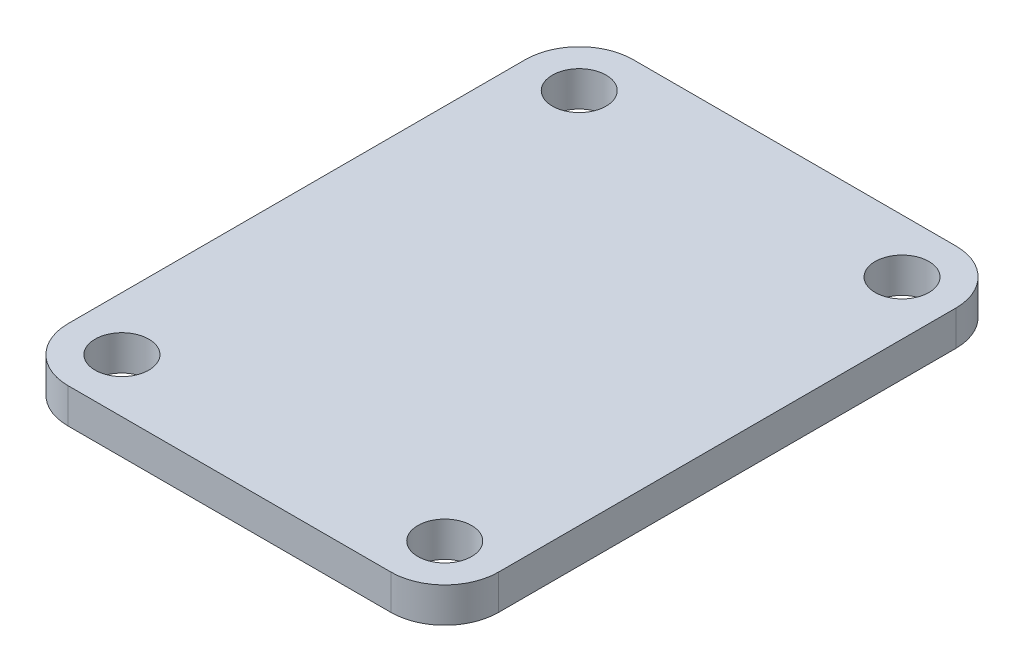
ISO-10303-21;
HEADER;
FILE_DESCRIPTION(('STEP AP214'),'2;1');
FILE_NAME('part.step','',(''),(''),'','','');
FILE_SCHEMA(('AUTOMOTIVE_DESIGN { 1 0 10303 214 1 1 1 1 }'));
ENDSEC;
DATA;
#1=APPLICATION_CONTEXT('core data for automotive mechanical design processes');
#2=APPLICATION_PROTOCOL_DEFINITION('international standard','automotive_design',2000,#1);
#3=PRODUCT_CONTEXT('',#1,'mechanical');
#4=PRODUCT('Part','Part','',(#3));
#5=PRODUCT_RELATED_PRODUCT_CATEGORY('part','',(#4));
#6=PRODUCT_DEFINITION_FORMATION('','',#4);
#7=PRODUCT_DEFINITION_CONTEXT('part definition',#1,'design');
#8=PRODUCT_DEFINITION('design','',#6,#7);
#9=PRODUCT_DEFINITION_SHAPE('','',#8);
#10=(LENGTH_UNIT() NAMED_UNIT(*) SI_UNIT(.MILLI.,.METRE.));
#11=(NAMED_UNIT(*) PLANE_ANGLE_UNIT() SI_UNIT($,.RADIAN.));
#12=(NAMED_UNIT(*) SI_UNIT($,.STERADIAN.) SOLID_ANGLE_UNIT());
#13=UNCERTAINTY_MEASURE_WITH_UNIT(LENGTH_MEASURE(1.E-05),#10,'distance_accuracy_value','');
#14=(GEOMETRIC_REPRESENTATION_CONTEXT(3) GLOBAL_UNCERTAINTY_ASSIGNED_CONTEXT((#13)) GLOBAL_UNIT_ASSIGNED_CONTEXT((#10,
#11,#12)) REPRESENTATION_CONTEXT('',''));
#15=CARTESIAN_POINT('',(0.,0.,0.));
#16=DIRECTION('',(0.,0.,1.));
#17=DIRECTION('',(1.,0.,0.));
#18=AXIS2_PLACEMENT_3D('',#15,#16,#17);
#19=CARTESIAN_POINT('',(0.,1.651,0.));
#20=DIRECTION('',(0.,1.,0.));
#21=DIRECTION('',(0.,0.,1.));
#22=AXIS2_PLACEMENT_3D('',#19,#20,#21);
#23=PLANE('',#22);
#24=CARTESIAN_POINT('',(7.62,1.651,10.795));
#25=DIRECTION('',(0.,1.,0.));
#26=DIRECTION('',(0.,0.,1.));
#27=AXIS2_PLACEMENT_3D('',#24,#25,#26);
#28=CIRCLE('',#27,1.27);
#29=CARTESIAN_POINT('',(7.62,1.651,9.525));
#30=VERTEX_POINT('',#29);
#31=EDGE_CURVE('E181',#30,#30,#28,.T.);
#32=ORIENTED_EDGE('',*,*,#31,.F.);
#33=EDGE_LOOP('',(#32));
#34=FACE_BOUND('',#33,.T.);
#35=CARTESIAN_POINT('',(-7.62,1.651,-10.795));
#36=DIRECTION('',(0.,1.,0.));
#37=DIRECTION('',(0.,0.,1.));
#38=AXIS2_PLACEMENT_3D('',#35,#36,#37);
#39=CIRCLE('',#38,1.27);
#40=CARTESIAN_POINT('',(-7.62,1.651,-12.065));
#41=VERTEX_POINT('',#40);
#42=EDGE_CURVE('E164',#41,#41,#39,.T.);
#43=ORIENTED_EDGE('',*,*,#42,.F.);
#44=EDGE_LOOP('',(#43));
#45=FACE_BOUND('',#44,.T.);
#46=DIRECTION('',(0.,0.,-1.));
#47=VECTOR('',#46,1.);
#48=CARTESIAN_POINT('',(10.16,1.651,13.335));
#49=LINE('',#48,#47);
#50=CARTESIAN_POINT('',(10.16,1.651,10.795));
#51=VERTEX_POINT('',#50);
#52=CARTESIAN_POINT('',(10.16,1.651,-10.795));
#53=VERTEX_POINT('',#52);
#54=EDGE_CURVE('E171',#51,#53,#49,.T.);
#55=ORIENTED_EDGE('',*,*,#54,.T.);
#56=CARTESIAN_POINT('',(7.62,1.651,-10.795));
#57=DIRECTION('',(0.,1.,0.));
#58=DIRECTION('',(0.,0.,1.));
#59=AXIS2_PLACEMENT_3D('',#56,#57,#58);
#60=CIRCLE('',#59,2.54);
#61=CARTESIAN_POINT('',(7.62,1.651,-13.335));
#62=VERTEX_POINT('',#61);
#63=EDGE_CURVE('E148',#53,#62,#60,.T.);
#64=ORIENTED_EDGE('',*,*,#63,.T.);
#65=DIRECTION('',(-1.,0.,0.));
#66=VECTOR('',#65,1.);
#67=CARTESIAN_POINT('',(10.16,1.651,-13.335));
#68=LINE('',#67,#66);
#69=CARTESIAN_POINT('',(-7.62,1.651,-13.335));
#70=VERTEX_POINT('',#69);
#71=EDGE_CURVE('E119',#62,#70,#68,.T.);
#72=ORIENTED_EDGE('',*,*,#71,.T.);
#73=CARTESIAN_POINT('',(-7.62,1.651,-10.795));
#74=DIRECTION('',(0.,1.,0.));
#75=DIRECTION('',(0.,0.,1.));
#76=AXIS2_PLACEMENT_3D('',#73,#74,#75);
#77=CIRCLE('',#76,2.54);
#78=CARTESIAN_POINT('',(-10.16,1.651,-10.795));
#79=VERTEX_POINT('',#78);
#80=EDGE_CURVE('E146',#70,#79,#77,.T.);
#81=ORIENTED_EDGE('',*,*,#80,.T.);
#82=DIRECTION('',(0.,0.,1.));
#83=VECTOR('',#82,1.);
#84=CARTESIAN_POINT('',(-10.16,1.651,13.335));
#85=LINE('',#84,#83);
#86=CARTESIAN_POINT('',(-10.16,1.651,10.795));
#87=VERTEX_POINT('',#86);
#88=EDGE_CURVE('E126',#79,#87,#85,.T.);
#89=ORIENTED_EDGE('',*,*,#88,.T.);
#90=CARTESIAN_POINT('',(-7.62,1.651,10.795));
#91=DIRECTION('',(0.,1.,0.));
#92=DIRECTION('',(0.,0.,1.));
#93=AXIS2_PLACEMENT_3D('',#90,#91,#92);
#94=CIRCLE('',#93,2.54);
#95=CARTESIAN_POINT('',(-7.62,1.651,13.335));
#96=VERTEX_POINT('',#95);
#97=EDGE_CURVE('E54',#87,#96,#94,.T.);
#98=ORIENTED_EDGE('',*,*,#97,.T.);
#99=DIRECTION('',(1.,0.,0.));
#100=VECTOR('',#99,1.);
#101=CARTESIAN_POINT('',(10.16,1.651,13.335));
#102=LINE('',#101,#100);
#103=CARTESIAN_POINT('',(7.62,1.651,13.335));
#104=VERTEX_POINT('',#103);
#105=EDGE_CURVE('E129',#96,#104,#102,.T.);
#106=ORIENTED_EDGE('',*,*,#105,.T.);
#107=CARTESIAN_POINT('',(7.62,1.651,10.795));
#108=DIRECTION('',(0.,1.,0.));
#109=DIRECTION('',(0.,0.,1.));
#110=AXIS2_PLACEMENT_3D('',#107,#108,#109);
#111=CIRCLE('',#110,2.54);
#112=EDGE_CURVE('E143',#104,#51,#111,.T.);
#113=ORIENTED_EDGE('',*,*,#112,.T.);
#114=EDGE_LOOP('',(#55,#64,#72,#81,#89,#98,#106,#113));
#115=FACE_BOUND('',#114,.T.);
#116=CARTESIAN_POINT('',(7.62,1.651,-10.795));
#117=DIRECTION('',(0.,1.,0.));
#118=DIRECTION('',(0.,0.,1.));
#119=AXIS2_PLACEMENT_3D('',#116,#117,#118);
#120=CIRCLE('',#119,1.27);
#121=CARTESIAN_POINT('',(7.62,1.651,-12.065));
#122=VERTEX_POINT('',#121);
#123=EDGE_CURVE('E176',#122,#122,#120,.T.);
#124=ORIENTED_EDGE('',*,*,#123,.F.);
#125=EDGE_LOOP('',(#124));
#126=FACE_BOUND('',#125,.T.);
#127=CARTESIAN_POINT('',(-7.62,1.651,10.795));
#128=DIRECTION('',(0.,1.,0.));
#129=DIRECTION('',(0.,0.,1.));
#130=AXIS2_PLACEMENT_3D('',#127,#128,#129);
#131=CIRCLE('',#130,1.27);
#132=CARTESIAN_POINT('',(-7.62,1.651,9.525));
#133=VERTEX_POINT('',#132);
#134=EDGE_CURVE('E187',#133,#133,#131,.T.);
#135=ORIENTED_EDGE('',*,*,#134,.F.);
#136=EDGE_LOOP('',(#135));
#137=FACE_BOUND('',#136,.T.);
#138=ADVANCED_FACE('F33',(#34,#45,#115,#126,#137),#23,.T.);
#139=CARTESIAN_POINT('',(0.,0.,0.));
#140=DIRECTION('',(0.,1.,0.));
#141=DIRECTION('',(0.,0.,1.));
#142=AXIS2_PLACEMENT_3D('',#139,#140,#141);
#143=PLANE('',#142);
#144=DIRECTION('',(-1.,0.,0.));
#145=VECTOR('',#144,1.);
#146=CARTESIAN_POINT('',(10.16,0.,-13.335));
#147=LINE('',#146,#145);
#148=CARTESIAN_POINT('',(7.62,0.,-13.335));
#149=VERTEX_POINT('',#148);
#150=CARTESIAN_POINT('',(-7.62,0.,-13.335));
#151=VERTEX_POINT('',#150);
#152=EDGE_CURVE('E116',#149,#151,#147,.T.);
#153=ORIENTED_EDGE('',*,*,#152,.F.);
#154=CARTESIAN_POINT('',(7.62,0.,-10.795));
#155=DIRECTION('',(0.,1.,0.));
#156=DIRECTION('',(0.,0.,1.));
#157=AXIS2_PLACEMENT_3D('',#154,#155,#156);
#158=CIRCLE('',#157,2.54);
#159=CARTESIAN_POINT('',(10.16,0.,-10.795));
#160=VERTEX_POINT('',#159);
#161=EDGE_CURVE('E99',#149,#160,#158,.F.);
#162=ORIENTED_EDGE('',*,*,#161,.T.);
#163=DIRECTION('',(0.,0.,-1.));
#164=VECTOR('',#163,1.);
#165=CARTESIAN_POINT('',(10.16,0.,13.335));
#166=LINE('',#165,#164);
#167=CARTESIAN_POINT('',(10.16,0.,10.795));
#168=VERTEX_POINT('',#167);
#169=EDGE_CURVE('E127',#168,#160,#166,.T.);
#170=ORIENTED_EDGE('',*,*,#169,.F.);
#171=CARTESIAN_POINT('',(7.62,0.,10.795));
#172=DIRECTION('',(0.,1.,0.));
#173=DIRECTION('',(0.,0.,1.));
#174=AXIS2_PLACEMENT_3D('',#171,#172,#173);
#175=CIRCLE('',#174,2.54);
#176=CARTESIAN_POINT('',(7.62,0.,13.335));
#177=VERTEX_POINT('',#176);
#178=EDGE_CURVE('E120',#168,#177,#175,.F.);
#179=ORIENTED_EDGE('',*,*,#178,.T.);
#180=DIRECTION('',(1.,0.,0.));
#181=VECTOR('',#180,1.);
#182=CARTESIAN_POINT('',(10.16,0.,13.335));
#183=LINE('',#182,#181);
#184=CARTESIAN_POINT('',(-7.62,0.,13.335));
#185=VERTEX_POINT('',#184);
#186=EDGE_CURVE('E131',#185,#177,#183,.T.);
#187=ORIENTED_EDGE('',*,*,#186,.F.);
#188=CARTESIAN_POINT('',(-7.62,0.,10.795));
#189=DIRECTION('',(0.,1.,0.));
#190=DIRECTION('',(0.,0.,1.));
#191=AXIS2_PLACEMENT_3D('',#188,#189,#190);
#192=CIRCLE('',#191,2.54);
#193=CARTESIAN_POINT('',(-10.16,0.,10.795));
#194=VERTEX_POINT('',#193);
#195=EDGE_CURVE('E137',#185,#194,#192,.F.);
#196=ORIENTED_EDGE('',*,*,#195,.T.);
#197=DIRECTION('',(0.,0.,1.));
#198=VECTOR('',#197,1.);
#199=CARTESIAN_POINT('',(-10.16,0.,13.335));
#200=LINE('',#199,#198);
#201=CARTESIAN_POINT('',(-10.16,0.,-10.795));
#202=VERTEX_POINT('',#201);
#203=EDGE_CURVE('E159',#202,#194,#200,.T.);
#204=ORIENTED_EDGE('',*,*,#203,.F.);
#205=CARTESIAN_POINT('',(-7.62,0.,-10.795));
#206=DIRECTION('',(0.,1.,0.));
#207=DIRECTION('',(0.,0.,1.));
#208=AXIS2_PLACEMENT_3D('',#205,#206,#207);
#209=CIRCLE('',#208,2.54);
#210=EDGE_CURVE('E110',#202,#151,#209,.F.);
#211=ORIENTED_EDGE('',*,*,#210,.T.);
#212=EDGE_LOOP('',(#153,#162,#170,#179,#187,#196,#204,#211));
#213=FACE_BOUND('',#212,.T.);
#214=CARTESIAN_POINT('',(-7.62,0.,-10.795));
#215=DIRECTION('',(0.,1.,0.));
#216=DIRECTION('',(0.,0.,1.));
#217=AXIS2_PLACEMENT_3D('',#214,#215,#216);
#218=CIRCLE('',#217,1.27);
#219=CARTESIAN_POINT('',(-7.62,0.,-12.065));
#220=VERTEX_POINT('',#219);
#221=EDGE_CURVE('E167',#220,#220,#218,.T.);
#222=ORIENTED_EDGE('',*,*,#221,.T.);
#223=EDGE_LOOP('',(#222));
#224=FACE_BOUND('',#223,.T.);
#225=CARTESIAN_POINT('',(7.62,0.,-10.795));
#226=DIRECTION('',(0.,1.,0.));
#227=DIRECTION('',(0.,0.,1.));
#228=AXIS2_PLACEMENT_3D('',#225,#226,#227);
#229=CIRCLE('',#228,1.27);
#230=CARTESIAN_POINT('',(7.62,0.,-12.065));
#231=VERTEX_POINT('',#230);
#232=EDGE_CURVE('E178',#231,#231,#229,.T.);
#233=ORIENTED_EDGE('',*,*,#232,.T.);
#234=EDGE_LOOP('',(#233));
#235=FACE_BOUND('',#234,.T.);
#236=CARTESIAN_POINT('',(7.62,0.,10.795));
#237=DIRECTION('',(0.,1.,0.));
#238=DIRECTION('',(0.,0.,1.));
#239=AXIS2_PLACEMENT_3D('',#236,#237,#238);
#240=CIRCLE('',#239,1.27);
#241=CARTESIAN_POINT('',(7.62,0.,9.525));
#242=VERTEX_POINT('',#241);
#243=EDGE_CURVE('E184',#242,#242,#240,.T.);
#244=ORIENTED_EDGE('',*,*,#243,.T.);
#245=EDGE_LOOP('',(#244));
#246=FACE_BOUND('',#245,.T.);
#247=CARTESIAN_POINT('',(-7.62,0.,10.795));
#248=DIRECTION('',(0.,1.,0.));
#249=DIRECTION('',(0.,0.,1.));
#250=AXIS2_PLACEMENT_3D('',#247,#248,#249);
#251=CIRCLE('',#250,1.27);
#252=CARTESIAN_POINT('',(-7.62,0.,9.525));
#253=VERTEX_POINT('',#252);
#254=EDGE_CURVE('E190',#253,#253,#251,.T.);
#255=ORIENTED_EDGE('',*,*,#254,.T.);
#256=EDGE_LOOP('',(#255));
#257=FACE_BOUND('',#256,.T.);
#258=ADVANCED_FACE('F123',(#213,#224,#235,#246,#257),#143,.F.);
#259=CARTESIAN_POINT('',(-10.16,1.651,13.335));
#260=DIRECTION('',(1.,0.,0.));
#261=DIRECTION('',(0.,0.,-1.));
#262=AXIS2_PLACEMENT_3D('',#259,#260,#261);
#263=PLANE('',#262);
#264=ORIENTED_EDGE('',*,*,#88,.F.);
#265=DIRECTION('',(0.,-1.,0.));
#266=VECTOR('',#265,1.);
#267=CARTESIAN_POINT('',(-10.16,1.651,-10.795));
#268=LINE('',#267,#266);
#269=EDGE_CURVE('E152',#79,#202,#268,.T.);
#270=ORIENTED_EDGE('',*,*,#269,.T.);
#271=ORIENTED_EDGE('',*,*,#203,.T.);
#272=DIRECTION('',(0.,-1.,0.));
#273=VECTOR('',#272,1.);
#274=CARTESIAN_POINT('',(-10.16,1.651,10.795));
#275=LINE('',#274,#273);
#276=EDGE_CURVE('E150',#194,#87,#275,.F.);
#277=ORIENTED_EDGE('',*,*,#276,.T.);
#278=EDGE_LOOP('',(#264,#270,#271,#277));
#279=FACE_BOUND('',#278,.T.);
#280=ADVANCED_FACE('F158',(#279),#263,.F.);
#281=CARTESIAN_POINT('',(10.16,1.651,13.335));
#282=DIRECTION('',(0.,0.,-1.));
#283=DIRECTION('',(-1.,0.,0.));
#284=AXIS2_PLACEMENT_3D('',#281,#282,#283);
#285=PLANE('',#284);
#286=ORIENTED_EDGE('',*,*,#105,.F.);
#287=DIRECTION('',(0.,-1.,0.));
#288=VECTOR('',#287,1.);
#289=CARTESIAN_POINT('',(-7.62,1.651,13.335));
#290=LINE('',#289,#288);
#291=EDGE_CURVE('E11',#96,#185,#290,.T.);
#292=ORIENTED_EDGE('',*,*,#291,.T.);
#293=ORIENTED_EDGE('',*,*,#186,.T.);
#294=DIRECTION('',(0.,-1.,0.));
#295=VECTOR('',#294,1.);
#296=CARTESIAN_POINT('',(7.62,1.651,13.335));
#297=LINE('',#296,#295);
#298=EDGE_CURVE('E41',#177,#104,#297,.F.);
#299=ORIENTED_EDGE('',*,*,#298,.T.);
#300=EDGE_LOOP('',(#286,#292,#293,#299));
#301=FACE_BOUND('',#300,.T.);
#302=ADVANCED_FACE('F217',(#301),#285,.F.);
#303=CARTESIAN_POINT('',(10.16,1.651,13.335));
#304=DIRECTION('',(-1.,0.,0.));
#305=DIRECTION('',(0.,0.,1.));
#306=AXIS2_PLACEMENT_3D('',#303,#304,#305);
#307=PLANE('',#306);
#308=ORIENTED_EDGE('',*,*,#169,.T.);
#309=DIRECTION('',(0.,-1.,0.));
#310=VECTOR('',#309,1.);
#311=CARTESIAN_POINT('',(10.16,1.651,-10.795));
#312=LINE('',#311,#310);
#313=EDGE_CURVE('E104',#160,#53,#312,.F.);
#314=ORIENTED_EDGE('',*,*,#313,.T.);
#315=ORIENTED_EDGE('',*,*,#54,.F.);
#316=DIRECTION('',(0.,-1.,0.));
#317=VECTOR('',#316,1.);
#318=CARTESIAN_POINT('',(10.16,1.651,10.795));
#319=LINE('',#318,#317);
#320=EDGE_CURVE('E109',#51,#168,#319,.T.);
#321=ORIENTED_EDGE('',*,*,#320,.T.);
#322=EDGE_LOOP('',(#308,#314,#315,#321));
#323=FACE_BOUND('',#322,.T.);
#324=ADVANCED_FACE('F214',(#323),#307,.F.);
#325=CARTESIAN_POINT('',(10.16,1.651,-13.335));
#326=DIRECTION('',(0.,0.,1.));
#327=DIRECTION('',(1.,0.,0.));
#328=AXIS2_PLACEMENT_3D('',#325,#326,#327);
#329=PLANE('',#328);
#330=ORIENTED_EDGE('',*,*,#71,.F.);
#331=DIRECTION('',(0.,-1.,0.));
#332=VECTOR('',#331,1.);
#333=CARTESIAN_POINT('',(7.62,1.651,-13.335));
#334=LINE('',#333,#332);
#335=EDGE_CURVE('E103',#62,#149,#334,.T.);
#336=ORIENTED_EDGE('',*,*,#335,.T.);
#337=ORIENTED_EDGE('',*,*,#152,.T.);
#338=DIRECTION('',(0.,-1.,0.));
#339=VECTOR('',#338,1.);
#340=CARTESIAN_POINT('',(-7.62,1.651,-13.335));
#341=LINE('',#340,#339);
#342=EDGE_CURVE('E121',#151,#70,#341,.F.);
#343=ORIENTED_EDGE('',*,*,#342,.T.);
#344=EDGE_LOOP('',(#330,#336,#337,#343));
#345=FACE_BOUND('',#344,.T.);
#346=ADVANCED_FACE('F115',(#345),#329,.F.);
#347=CARTESIAN_POINT('',(-7.62,1.651,-10.795));
#348=DIRECTION('',(0.,-1.,0.));
#349=DIRECTION('',(0.,0.,-1.));
#350=AXIS2_PLACEMENT_3D('',#347,#348,#349);
#351=CYLINDRICAL_SURFACE('',#350,1.27);
#352=CARTESIAN_POINT('',(-7.62,1.651,-12.065));
#353=CARTESIAN_POINT('',(-7.62,1.63380208333333,-12.065));
#354=CARTESIAN_POINT('',(-7.62,1.61660416666667,-12.065));
#355=CARTESIAN_POINT('',(-7.62,1.58220833333333,-12.065));
#356=CARTESIAN_POINT('',(-7.62,1.56501041666667,-12.065));
#357=CARTESIAN_POINT('',(-7.62,1.53061458333333,-12.065));
#358=CARTESIAN_POINT('',(-7.62,1.51341666666667,-12.065));
#359=CARTESIAN_POINT('',(-7.62,1.47902083333333,-12.065));
#360=CARTESIAN_POINT('',(-7.62,1.46182291666667,-12.065));
#361=CARTESIAN_POINT('',(-7.62,1.42742708333333,-12.065));
#362=CARTESIAN_POINT('',(-7.62,1.41022916666667,-12.065));
#363=CARTESIAN_POINT('',(-7.62,1.37583333333333,-12.065));
#364=CARTESIAN_POINT('',(-7.62,1.35863541666667,-12.065));
#365=CARTESIAN_POINT('',(-7.62,1.32423958333333,-12.065));
#366=CARTESIAN_POINT('',(-7.62,1.30704166666667,-12.065));
#367=CARTESIAN_POINT('',(-7.62,1.27264583333333,-12.065));
#368=CARTESIAN_POINT('',(-7.62,1.25544791666667,-12.065));
#369=CARTESIAN_POINT('',(-7.62,1.22105208333333,-12.065));
#370=CARTESIAN_POINT('',(-7.62,1.20385416666667,-12.065));
#371=CARTESIAN_POINT('',(-7.62,1.16945833333333,-12.065));
#372=CARTESIAN_POINT('',(-7.62,1.15226041666667,-12.065));
#373=CARTESIAN_POINT('',(-7.62,1.11786458333333,-12.065));
#374=CARTESIAN_POINT('',(-7.62,1.10066666666667,-12.065));
#375=CARTESIAN_POINT('',(-7.62,1.06627083333333,-12.065));
#376=CARTESIAN_POINT('',(-7.62,1.04907291666667,-12.065));
#377=CARTESIAN_POINT('',(-7.62,1.01467708333333,-12.065));
#378=CARTESIAN_POINT('',(-7.62,0.997479166666666,-12.065));
#379=CARTESIAN_POINT('',(-7.62,0.963083333333333,-12.065));
#380=CARTESIAN_POINT('',(-7.62,0.945885416666666,-12.065));
#381=CARTESIAN_POINT('',(-7.62,0.911489583333333,-12.065));
#382=CARTESIAN_POINT('',(-7.62,0.894291666666666,-12.065));
#383=CARTESIAN_POINT('',(-7.62,0.859895833333333,-12.065));
#384=CARTESIAN_POINT('',(-7.62,0.842697916666666,-12.065));
#385=CARTESIAN_POINT('',(-7.62,0.808302083333333,-12.065));
#386=CARTESIAN_POINT('',(-7.62,0.791104166666666,-12.065));
#387=CARTESIAN_POINT('',(-7.62,0.756708333333333,-12.065));
#388=CARTESIAN_POINT('',(-7.62,0.739510416666667,-12.065));
#389=CARTESIAN_POINT('',(-7.62,0.705114583333333,-12.065));
#390=CARTESIAN_POINT('',(-7.62,0.687916666666667,-12.065));
#391=CARTESIAN_POINT('',(-7.62,0.653520833333333,-12.065));
#392=CARTESIAN_POINT('',(-7.62,0.636322916666667,-12.065));
#393=CARTESIAN_POINT('',(-7.62,0.601927083333333,-12.065));
#394=CARTESIAN_POINT('',(-7.62,0.584729166666667,-12.065));
#395=CARTESIAN_POINT('',(-7.62,0.550333333333333,-12.065));
#396=CARTESIAN_POINT('',(-7.62,0.533135416666667,-12.065));
#397=CARTESIAN_POINT('',(-7.62,0.498739583333333,-12.065));
#398=CARTESIAN_POINT('',(-7.62,0.481541666666667,-12.065));
#399=CARTESIAN_POINT('',(-7.62,0.447145833333333,-12.065));
#400=CARTESIAN_POINT('',(-7.62,0.429947916666667,-12.065));
#401=CARTESIAN_POINT('',(-7.62,0.395552083333333,-12.065));
#402=CARTESIAN_POINT('',(-7.62,0.378354166666667,-12.065));
#403=CARTESIAN_POINT('',(-7.62,0.343958333333333,-12.065));
#404=CARTESIAN_POINT('',(-7.62,0.326760416666667,-12.065));
#405=CARTESIAN_POINT('',(-7.62,0.292364583333333,-12.065));
#406=CARTESIAN_POINT('',(-7.62,0.275166666666667,-12.065));
#407=CARTESIAN_POINT('',(-7.62,0.240770833333333,-12.065));
#408=CARTESIAN_POINT('',(-7.62,0.223572916666667,-12.065));
#409=CARTESIAN_POINT('',(-7.62,0.189177083333333,-12.065));
#410=CARTESIAN_POINT('',(-7.62,0.171979166666667,-12.065));
#411=CARTESIAN_POINT('',(-7.62,0.137583333333333,-12.065));
#412=CARTESIAN_POINT('',(-7.62,0.120385416666667,-12.065));
#413=CARTESIAN_POINT('',(-7.62,0.0859895833333333,-12.065));
#414=CARTESIAN_POINT('',(-7.62,0.0687916666666667,-12.065));
#415=CARTESIAN_POINT('',(-7.62,0.0343958333333333,-12.065));
#416=CARTESIAN_POINT('',(-7.62,0.0171979166666666,-12.065));
#417=CARTESIAN_POINT('',(-7.62,0.,-12.065));
#418=B_SPLINE_CURVE_WITH_KNOTS('',3,(#352,#353,#354,#355,#356,#357,#358,#359,#360,#361,#362,
#363,#364,#365,#366,#367,#368,#369,#370,#371,#372,#373,#374,#375,#376,#377,#378,#379,#380,#381,
#382,#383,#384,#385,#386,#387,#388,#389,#390,#391,#392,#393,#394,#395,#396,#397,#398,#399,#400,
#401,#402,#403,#404,#405,#406,#407,#408,#409,#410,#411,#412,#413,#414,#415,#416,#417),
.UNSPECIFIED.,.F.,.F.,(4,2,2,2,2,2,2,2,2,2,2,2,2,2,2,2,2,2,2,2,2,2,2,2,2,2,2,2,2,2,2,2,4),(0.,
0.0515937500000002,0.1031875,0.15478125,0.206375,0.25796875,0.3095625,0.36115625,0.41275,
0.46434375,0.5159375,0.56753125,0.619125,0.67071875,0.7223125,0.77390625,0.8255,0.87709375,
0.9286875,0.98028125,1.031875,1.08346875,1.1350625,1.18665625,1.23825,1.28984375,1.3414375,
1.39303125,1.444625,1.49621875,1.5478125,1.59940625,1.651),.UNSPECIFIED.);
#419=EDGE_CURVE('BSEAM209',#41,#220,#418,.T.);
#420=ORIENTED_EDGE('',*,*,#42,.T.);
#421=ORIENTED_EDGE('',*,*,#221,.F.);
#422=ORIENTED_EDGE('',*,*,#419,.T.);
#423=ORIENTED_EDGE('',*,*,#419,.F.);
#424=EDGE_LOOP('',(#420,#422,#421,#423));
#425=FACE_BOUND('',#424,.T.);
#426=ADVANCED_FACE('F209',(#425),#351,.F.);
#427=CARTESIAN_POINT('',(7.62,1.651,-10.795));
#428=DIRECTION('',(0.,-1.,0.));
#429=DIRECTION('',(0.,0.,-1.));
#430=AXIS2_PLACEMENT_3D('',#427,#428,#429);
#431=CYLINDRICAL_SURFACE('',#430,1.27);
#432=CARTESIAN_POINT('',(7.62,1.651,-12.065));
#433=CARTESIAN_POINT('',(7.62,1.63380208333333,-12.065));
#434=CARTESIAN_POINT('',(7.62,1.61660416666667,-12.065));
#435=CARTESIAN_POINT('',(7.62,1.58220833333333,-12.065));
#436=CARTESIAN_POINT('',(7.62,1.56501041666667,-12.065));
#437=CARTESIAN_POINT('',(7.62,1.53061458333333,-12.065));
#438=CARTESIAN_POINT('',(7.62,1.51341666666667,-12.065));
#439=CARTESIAN_POINT('',(7.62,1.47902083333333,-12.065));
#440=CARTESIAN_POINT('',(7.62,1.46182291666667,-12.065));
#441=CARTESIAN_POINT('',(7.62,1.42742708333333,-12.065));
#442=CARTESIAN_POINT('',(7.62,1.41022916666667,-12.065));
#443=CARTESIAN_POINT('',(7.62,1.37583333333333,-12.065));
#444=CARTESIAN_POINT('',(7.62,1.35863541666667,-12.065));
#445=CARTESIAN_POINT('',(7.62,1.32423958333333,-12.065));
#446=CARTESIAN_POINT('',(7.62,1.30704166666667,-12.065));
#447=CARTESIAN_POINT('',(7.62,1.27264583333333,-12.065));
#448=CARTESIAN_POINT('',(7.62,1.25544791666667,-12.065));
#449=CARTESIAN_POINT('',(7.62,1.22105208333333,-12.065));
#450=CARTESIAN_POINT('',(7.62,1.20385416666667,-12.065));
#451=CARTESIAN_POINT('',(7.62,1.16945833333333,-12.065));
#452=CARTESIAN_POINT('',(7.62,1.15226041666667,-12.065));
#453=CARTESIAN_POINT('',(7.62,1.11786458333333,-12.065));
#454=CARTESIAN_POINT('',(7.62,1.10066666666667,-12.065));
#455=CARTESIAN_POINT('',(7.62,1.06627083333333,-12.065));
#456=CARTESIAN_POINT('',(7.62,1.04907291666667,-12.065));
#457=CARTESIAN_POINT('',(7.62,1.01467708333333,-12.065));
#458=CARTESIAN_POINT('',(7.62,0.997479166666666,-12.065));
#459=CARTESIAN_POINT('',(7.62,0.963083333333333,-12.065));
#460=CARTESIAN_POINT('',(7.62,0.945885416666666,-12.065));
#461=CARTESIAN_POINT('',(7.62,0.911489583333333,-12.065));
#462=CARTESIAN_POINT('',(7.62,0.894291666666666,-12.065));
#463=CARTESIAN_POINT('',(7.62,0.859895833333333,-12.065));
#464=CARTESIAN_POINT('',(7.62,0.842697916666666,-12.065));
#465=CARTESIAN_POINT('',(7.62,0.808302083333333,-12.065));
#466=CARTESIAN_POINT('',(7.62,0.791104166666666,-12.065));
#467=CARTESIAN_POINT('',(7.62,0.756708333333333,-12.065));
#468=CARTESIAN_POINT('',(7.62,0.739510416666667,-12.065));
#469=CARTESIAN_POINT('',(7.62,0.705114583333333,-12.065));
#470=CARTESIAN_POINT('',(7.62,0.687916666666667,-12.065));
#471=CARTESIAN_POINT('',(7.62,0.653520833333333,-12.065));
#472=CARTESIAN_POINT('',(7.62,0.636322916666667,-12.065));
#473=CARTESIAN_POINT('',(7.62,0.601927083333333,-12.065));
#474=CARTESIAN_POINT('',(7.62,0.584729166666667,-12.065));
#475=CARTESIAN_POINT('',(7.62,0.550333333333333,-12.065));
#476=CARTESIAN_POINT('',(7.62,0.533135416666667,-12.065));
#477=CARTESIAN_POINT('',(7.62,0.498739583333333,-12.065));
#478=CARTESIAN_POINT('',(7.62,0.481541666666667,-12.065));
#479=CARTESIAN_POINT('',(7.62,0.447145833333333,-12.065));
#480=CARTESIAN_POINT('',(7.62,0.429947916666667,-12.065));
#481=CARTESIAN_POINT('',(7.62,0.395552083333333,-12.065));
#482=CARTESIAN_POINT('',(7.62,0.378354166666667,-12.065));
#483=CARTESIAN_POINT('',(7.62,0.343958333333333,-12.065));
#484=CARTESIAN_POINT('',(7.62,0.326760416666667,-12.065));
#485=CARTESIAN_POINT('',(7.62,0.292364583333333,-12.065));
#486=CARTESIAN_POINT('',(7.62,0.275166666666667,-12.065));
#487=CARTESIAN_POINT('',(7.62,0.240770833333333,-12.065));
#488=CARTESIAN_POINT('',(7.62,0.223572916666667,-12.065));
#489=CARTESIAN_POINT('',(7.62,0.189177083333333,-12.065));
#490=CARTESIAN_POINT('',(7.62,0.171979166666667,-12.065));
#491=CARTESIAN_POINT('',(7.62,0.137583333333333,-12.065));
#492=CARTESIAN_POINT('',(7.62,0.120385416666667,-12.065));
#493=CARTESIAN_POINT('',(7.62,0.0859895833333333,-12.065));
#494=CARTESIAN_POINT('',(7.62,0.0687916666666667,-12.065));
#495=CARTESIAN_POINT('',(7.62,0.0343958333333333,-12.065));
#496=CARTESIAN_POINT('',(7.62,0.0171979166666666,-12.065));
#497=CARTESIAN_POINT('',(7.62,0.,-12.065));
#498=B_SPLINE_CURVE_WITH_KNOTS('',3,(#432,#433,#434,#435,#436,#437,#438,#439,#440,#441,#442,
#443,#444,#445,#446,#447,#448,#449,#450,#451,#452,#453,#454,#455,#456,#457,#458,#459,#460,#461,
#462,#463,#464,#465,#466,#467,#468,#469,#470,#471,#472,#473,#474,#475,#476,#477,#478,#479,#480,
#481,#482,#483,#484,#485,#486,#487,#488,#489,#490,#491,#492,#493,#494,#495,#496,#497),
.UNSPECIFIED.,.F.,.F.,(4,2,2,2,2,2,2,2,2,2,2,2,2,2,2,2,2,2,2,2,2,2,2,2,2,2,2,2,2,2,2,2,4),(0.,
0.0515937500000002,0.1031875,0.15478125,0.206375,0.25796875,0.3095625,0.36115625,0.41275,
0.46434375,0.5159375,0.56753125,0.619125,0.67071875,0.7223125,0.77390625,0.8255,0.87709375,
0.9286875,0.98028125,1.031875,1.08346875,1.1350625,1.18665625,1.23825,1.28984375,1.3414375,
1.39303125,1.444625,1.49621875,1.5478125,1.59940625,1.651),.UNSPECIFIED.);
#499=EDGE_CURVE('BSEAM241',#122,#231,#498,.T.);
#500=ORIENTED_EDGE('',*,*,#123,.T.);
#501=ORIENTED_EDGE('',*,*,#232,.F.);
#502=ORIENTED_EDGE('',*,*,#499,.T.);
#503=ORIENTED_EDGE('',*,*,#499,.F.);
#504=EDGE_LOOP('',(#500,#502,#501,#503));
#505=FACE_BOUND('',#504,.T.);
#506=ADVANCED_FACE('F241',(#505),#431,.F.);
#507=CARTESIAN_POINT('',(7.62,1.651,10.795));
#508=DIRECTION('',(0.,-1.,0.));
#509=DIRECTION('',(0.,0.,-1.));
#510=AXIS2_PLACEMENT_3D('',#507,#508,#509);
#511=CYLINDRICAL_SURFACE('',#510,1.27);
#512=CARTESIAN_POINT('',(7.62,1.651,9.525));
#513=CARTESIAN_POINT('',(7.62,1.63380208333333,9.525));
#514=CARTESIAN_POINT('',(7.62,1.61660416666667,9.525));
#515=CARTESIAN_POINT('',(7.62,1.58220833333333,9.525));
#516=CARTESIAN_POINT('',(7.62,1.56501041666667,9.525));
#517=CARTESIAN_POINT('',(7.62,1.53061458333333,9.525));
#518=CARTESIAN_POINT('',(7.62,1.51341666666667,9.525));
#519=CARTESIAN_POINT('',(7.62,1.47902083333333,9.525));
#520=CARTESIAN_POINT('',(7.62,1.46182291666667,9.525));
#521=CARTESIAN_POINT('',(7.62,1.42742708333333,9.525));
#522=CARTESIAN_POINT('',(7.62,1.41022916666667,9.525));
#523=CARTESIAN_POINT('',(7.62,1.37583333333333,9.525));
#524=CARTESIAN_POINT('',(7.62,1.35863541666667,9.525));
#525=CARTESIAN_POINT('',(7.62,1.32423958333333,9.525));
#526=CARTESIAN_POINT('',(7.62,1.30704166666667,9.525));
#527=CARTESIAN_POINT('',(7.62,1.27264583333333,9.525));
#528=CARTESIAN_POINT('',(7.62,1.25544791666667,9.525));
#529=CARTESIAN_POINT('',(7.62,1.22105208333333,9.525));
#530=CARTESIAN_POINT('',(7.62,1.20385416666667,9.525));
#531=CARTESIAN_POINT('',(7.62,1.16945833333333,9.525));
#532=CARTESIAN_POINT('',(7.62,1.15226041666667,9.525));
#533=CARTESIAN_POINT('',(7.62,1.11786458333333,9.525));
#534=CARTESIAN_POINT('',(7.62,1.10066666666667,9.525));
#535=CARTESIAN_POINT('',(7.62,1.06627083333333,9.525));
#536=CARTESIAN_POINT('',(7.62,1.04907291666667,9.525));
#537=CARTESIAN_POINT('',(7.62,1.01467708333333,9.525));
#538=CARTESIAN_POINT('',(7.62,0.997479166666666,9.525));
#539=CARTESIAN_POINT('',(7.62,0.963083333333333,9.525));
#540=CARTESIAN_POINT('',(7.62,0.945885416666666,9.525));
#541=CARTESIAN_POINT('',(7.62,0.911489583333333,9.525));
#542=CARTESIAN_POINT('',(7.62,0.894291666666666,9.525));
#543=CARTESIAN_POINT('',(7.62,0.859895833333333,9.525));
#544=CARTESIAN_POINT('',(7.62,0.842697916666666,9.525));
#545=CARTESIAN_POINT('',(7.62,0.808302083333333,9.525));
#546=CARTESIAN_POINT('',(7.62,0.791104166666666,9.525));
#547=CARTESIAN_POINT('',(7.62,0.756708333333333,9.525));
#548=CARTESIAN_POINT('',(7.62,0.739510416666667,9.525));
#549=CARTESIAN_POINT('',(7.62,0.705114583333333,9.525));
#550=CARTESIAN_POINT('',(7.62,0.687916666666667,9.525));
#551=CARTESIAN_POINT('',(7.62,0.653520833333333,9.525));
#552=CARTESIAN_POINT('',(7.62,0.636322916666667,9.525));
#553=CARTESIAN_POINT('',(7.62,0.601927083333333,9.525));
#554=CARTESIAN_POINT('',(7.62,0.584729166666667,9.525));
#555=CARTESIAN_POINT('',(7.62,0.550333333333333,9.525));
#556=CARTESIAN_POINT('',(7.62,0.533135416666667,9.525));
#557=CARTESIAN_POINT('',(7.62,0.498739583333333,9.525));
#558=CARTESIAN_POINT('',(7.62,0.481541666666667,9.525));
#559=CARTESIAN_POINT('',(7.62,0.447145833333333,9.525));
#560=CARTESIAN_POINT('',(7.62,0.429947916666667,9.525));
#561=CARTESIAN_POINT('',(7.62,0.395552083333333,9.525));
#562=CARTESIAN_POINT('',(7.62,0.378354166666667,9.525));
#563=CARTESIAN_POINT('',(7.62,0.343958333333333,9.525));
#564=CARTESIAN_POINT('',(7.62,0.326760416666667,9.525));
#565=CARTESIAN_POINT('',(7.62,0.292364583333333,9.525));
#566=CARTESIAN_POINT('',(7.62,0.275166666666667,9.525));
#567=CARTESIAN_POINT('',(7.62,0.240770833333333,9.525));
#568=CARTESIAN_POINT('',(7.62,0.223572916666667,9.525));
#569=CARTESIAN_POINT('',(7.62,0.189177083333333,9.525));
#570=CARTESIAN_POINT('',(7.62,0.171979166666667,9.525));
#571=CARTESIAN_POINT('',(7.62,0.137583333333333,9.525));
#572=CARTESIAN_POINT('',(7.62,0.120385416666667,9.525));
#573=CARTESIAN_POINT('',(7.62,0.0859895833333333,9.525));
#574=CARTESIAN_POINT('',(7.62,0.0687916666666667,9.525));
#575=CARTESIAN_POINT('',(7.62,0.0343958333333333,9.525));
#576=CARTESIAN_POINT('',(7.62,0.0171979166666666,9.525));
#577=CARTESIAN_POINT('',(7.62,0.,9.525));
#578=B_SPLINE_CURVE_WITH_KNOTS('',3,(#512,#513,#514,#515,#516,#517,#518,#519,#520,#521,#522,
#523,#524,#525,#526,#527,#528,#529,#530,#531,#532,#533,#534,#535,#536,#537,#538,#539,#540,#541,
#542,#543,#544,#545,#546,#547,#548,#549,#550,#551,#552,#553,#554,#555,#556,#557,#558,#559,#560,
#561,#562,#563,#564,#565,#566,#567,#568,#569,#570,#571,#572,#573,#574,#575,#576,#577),
.UNSPECIFIED.,.F.,.F.,(4,2,2,2,2,2,2,2,2,2,2,2,2,2,2,2,2,2,2,2,2,2,2,2,2,2,2,2,2,2,2,2,4),(0.,
0.0515937500000002,0.1031875,0.15478125,0.206375,0.25796875,0.3095625,0.36115625,0.41275,
0.46434375,0.5159375,0.56753125,0.619125,0.67071875,0.7223125,0.77390625,0.8255,0.87709375,
0.9286875,0.98028125,1.031875,1.08346875,1.1350625,1.18665625,1.23825,1.28984375,1.3414375,
1.39303125,1.444625,1.49621875,1.5478125,1.59940625,1.651),.UNSPECIFIED.);
#579=EDGE_CURVE('BSEAM244',#30,#242,#578,.T.);
#580=ORIENTED_EDGE('',*,*,#31,.T.);
#581=ORIENTED_EDGE('',*,*,#243,.F.);
#582=ORIENTED_EDGE('',*,*,#579,.T.);
#583=ORIENTED_EDGE('',*,*,#579,.F.);
#584=EDGE_LOOP('',(#580,#582,#581,#583));
#585=FACE_BOUND('',#584,.T.);
#586=ADVANCED_FACE('F244',(#585),#511,.F.);
#587=CARTESIAN_POINT('',(-7.62,1.651,10.795));
#588=DIRECTION('',(0.,-1.,0.));
#589=DIRECTION('',(0.,0.,-1.));
#590=AXIS2_PLACEMENT_3D('',#587,#588,#589);
#591=CYLINDRICAL_SURFACE('',#590,1.27);
#592=CARTESIAN_POINT('',(-7.62,1.651,9.525));
#593=CARTESIAN_POINT('',(-7.62,1.63380208333333,9.525));
#594=CARTESIAN_POINT('',(-7.62,1.61660416666667,9.525));
#595=CARTESIAN_POINT('',(-7.62,1.58220833333333,9.525));
#596=CARTESIAN_POINT('',(-7.62,1.56501041666667,9.525));
#597=CARTESIAN_POINT('',(-7.62,1.53061458333333,9.525));
#598=CARTESIAN_POINT('',(-7.62,1.51341666666667,9.525));
#599=CARTESIAN_POINT('',(-7.62,1.47902083333333,9.525));
#600=CARTESIAN_POINT('',(-7.62,1.46182291666667,9.525));
#601=CARTESIAN_POINT('',(-7.62,1.42742708333333,9.525));
#602=CARTESIAN_POINT('',(-7.62,1.41022916666667,9.525));
#603=CARTESIAN_POINT('',(-7.62,1.37583333333333,9.525));
#604=CARTESIAN_POINT('',(-7.62,1.35863541666667,9.525));
#605=CARTESIAN_POINT('',(-7.62,1.32423958333333,9.525));
#606=CARTESIAN_POINT('',(-7.62,1.30704166666667,9.525));
#607=CARTESIAN_POINT('',(-7.62,1.27264583333333,9.525));
#608=CARTESIAN_POINT('',(-7.62,1.25544791666667,9.525));
#609=CARTESIAN_POINT('',(-7.62,1.22105208333333,9.525));
#610=CARTESIAN_POINT('',(-7.62,1.20385416666667,9.525));
#611=CARTESIAN_POINT('',(-7.62,1.16945833333333,9.525));
#612=CARTESIAN_POINT('',(-7.62,1.15226041666667,9.525));
#613=CARTESIAN_POINT('',(-7.62,1.11786458333333,9.525));
#614=CARTESIAN_POINT('',(-7.62,1.10066666666667,9.525));
#615=CARTESIAN_POINT('',(-7.62,1.06627083333333,9.525));
#616=CARTESIAN_POINT('',(-7.62,1.04907291666667,9.525));
#617=CARTESIAN_POINT('',(-7.62,1.01467708333333,9.525));
#618=CARTESIAN_POINT('',(-7.62,0.997479166666666,9.525));
#619=CARTESIAN_POINT('',(-7.62,0.963083333333333,9.525));
#620=CARTESIAN_POINT('',(-7.62,0.945885416666666,9.525));
#621=CARTESIAN_POINT('',(-7.62,0.911489583333333,9.525));
#622=CARTESIAN_POINT('',(-7.62,0.894291666666666,9.525));
#623=CARTESIAN_POINT('',(-7.62,0.859895833333333,9.525));
#624=CARTESIAN_POINT('',(-7.62,0.842697916666666,9.525));
#625=CARTESIAN_POINT('',(-7.62,0.808302083333333,9.525));
#626=CARTESIAN_POINT('',(-7.62,0.791104166666666,9.525));
#627=CARTESIAN_POINT('',(-7.62,0.756708333333333,9.525));
#628=CARTESIAN_POINT('',(-7.62,0.739510416666667,9.525));
#629=CARTESIAN_POINT('',(-7.62,0.705114583333333,9.525));
#630=CARTESIAN_POINT('',(-7.62,0.687916666666667,9.525));
#631=CARTESIAN_POINT('',(-7.62,0.653520833333333,9.525));
#632=CARTESIAN_POINT('',(-7.62,0.636322916666667,9.525));
#633=CARTESIAN_POINT('',(-7.62,0.601927083333333,9.525));
#634=CARTESIAN_POINT('',(-7.62,0.584729166666667,9.525));
#635=CARTESIAN_POINT('',(-7.62,0.550333333333333,9.525));
#636=CARTESIAN_POINT('',(-7.62,0.533135416666667,9.525));
#637=CARTESIAN_POINT('',(-7.62,0.498739583333333,9.525));
#638=CARTESIAN_POINT('',(-7.62,0.481541666666667,9.525));
#639=CARTESIAN_POINT('',(-7.62,0.447145833333333,9.525));
#640=CARTESIAN_POINT('',(-7.62,0.429947916666667,9.525));
#641=CARTESIAN_POINT('',(-7.62,0.395552083333333,9.525));
#642=CARTESIAN_POINT('',(-7.62,0.378354166666667,9.525));
#643=CARTESIAN_POINT('',(-7.62,0.343958333333333,9.525));
#644=CARTESIAN_POINT('',(-7.62,0.326760416666667,9.525));
#645=CARTESIAN_POINT('',(-7.62,0.292364583333333,9.525));
#646=CARTESIAN_POINT('',(-7.62,0.275166666666667,9.525));
#647=CARTESIAN_POINT('',(-7.62,0.240770833333333,9.525));
#648=CARTESIAN_POINT('',(-7.62,0.223572916666667,9.525));
#649=CARTESIAN_POINT('',(-7.62,0.189177083333333,9.525));
#650=CARTESIAN_POINT('',(-7.62,0.171979166666667,9.525));
#651=CARTESIAN_POINT('',(-7.62,0.137583333333333,9.525));
#652=CARTESIAN_POINT('',(-7.62,0.120385416666667,9.525));
#653=CARTESIAN_POINT('',(-7.62,0.0859895833333333,9.525));
#654=CARTESIAN_POINT('',(-7.62,0.0687916666666667,9.525));
#655=CARTESIAN_POINT('',(-7.62,0.0343958333333333,9.525));
#656=CARTESIAN_POINT('',(-7.62,0.0171979166666666,9.525));
#657=CARTESIAN_POINT('',(-7.62,0.,9.525));
#658=B_SPLINE_CURVE_WITH_KNOTS('',3,(#592,#593,#594,#595,#596,#597,#598,#599,#600,#601,#602,
#603,#604,#605,#606,#607,#608,#609,#610,#611,#612,#613,#614,#615,#616,#617,#618,#619,#620,#621,
#622,#623,#624,#625,#626,#627,#628,#629,#630,#631,#632,#633,#634,#635,#636,#637,#638,#639,#640,
#641,#642,#643,#644,#645,#646,#647,#648,#649,#650,#651,#652,#653,#654,#655,#656,#657),
.UNSPECIFIED.,.F.,.F.,(4,2,2,2,2,2,2,2,2,2,2,2,2,2,2,2,2,2,2,2,2,2,2,2,2,2,2,2,2,2,2,2,4),(0.,
0.0515937500000002,0.1031875,0.15478125,0.206375,0.25796875,0.3095625,0.36115625,0.41275,
0.46434375,0.5159375,0.56753125,0.619125,0.67071875,0.7223125,0.77390625,0.8255,0.87709375,
0.9286875,0.98028125,1.031875,1.08346875,1.1350625,1.18665625,1.23825,1.28984375,1.3414375,
1.39303125,1.444625,1.49621875,1.5478125,1.59940625,1.651),.UNSPECIFIED.);
#659=EDGE_CURVE('BSEAM196',#133,#253,#658,.T.);
#660=ORIENTED_EDGE('',*,*,#134,.T.);
#661=ORIENTED_EDGE('',*,*,#254,.F.);
#662=ORIENTED_EDGE('',*,*,#659,.T.);
#663=ORIENTED_EDGE('',*,*,#659,.F.);
#664=EDGE_LOOP('',(#660,#662,#661,#663));
#665=FACE_BOUND('',#664,.T.);
#666=ADVANCED_FACE('F196',(#665),#591,.F.);
#667=CARTESIAN_POINT('',(7.62,1.651,-10.795));
#668=DIRECTION('',(0.,-1.,0.));
#669=DIRECTION('',(0.,0.,-1.));
#670=AXIS2_PLACEMENT_3D('',#667,#668,#669);
#671=CYLINDRICAL_SURFACE('',#670,2.54);
#672=ORIENTED_EDGE('',*,*,#63,.F.);
#673=ORIENTED_EDGE('',*,*,#313,.F.);
#674=ORIENTED_EDGE('',*,*,#161,.F.);
#675=ORIENTED_EDGE('',*,*,#335,.F.);
#676=EDGE_LOOP('',(#672,#673,#674,#675));
#677=FACE_BOUND('',#676,.T.);
#678=ADVANCED_FACE('F102',(#677),#671,.T.);
#679=CARTESIAN_POINT('',(-7.62,1.651,-10.795));
#680=DIRECTION('',(0.,-1.,0.));
#681=DIRECTION('',(0.,0.,-1.));
#682=AXIS2_PLACEMENT_3D('',#679,#680,#681);
#683=CYLINDRICAL_SURFACE('',#682,2.54);
#684=ORIENTED_EDGE('',*,*,#80,.F.);
#685=ORIENTED_EDGE('',*,*,#342,.F.);
#686=ORIENTED_EDGE('',*,*,#210,.F.);
#687=ORIENTED_EDGE('',*,*,#269,.F.);
#688=EDGE_LOOP('',(#684,#685,#686,#687));
#689=FACE_BOUND('',#688,.T.);
#690=ADVANCED_FACE('F225',(#689),#683,.T.);
#691=CARTESIAN_POINT('',(-7.62,1.651,10.795));
#692=DIRECTION('',(0.,-1.,0.));
#693=DIRECTION('',(0.,0.,-1.));
#694=AXIS2_PLACEMENT_3D('',#691,#692,#693);
#695=CYLINDRICAL_SURFACE('',#694,2.54);
#696=ORIENTED_EDGE('',*,*,#97,.F.);
#697=ORIENTED_EDGE('',*,*,#276,.F.);
#698=ORIENTED_EDGE('',*,*,#195,.F.);
#699=ORIENTED_EDGE('',*,*,#291,.F.);
#700=EDGE_LOOP('',(#696,#697,#698,#699));
#701=FACE_BOUND('',#700,.T.);
#702=ADVANCED_FACE('F227',(#701),#695,.T.);
#703=CARTESIAN_POINT('',(7.62,1.651,10.795));
#704=DIRECTION('',(0.,-1.,0.));
#705=DIRECTION('',(0.,0.,-1.));
#706=AXIS2_PLACEMENT_3D('',#703,#704,#705);
#707=CYLINDRICAL_SURFACE('',#706,2.54);
#708=ORIENTED_EDGE('',*,*,#112,.F.);
#709=ORIENTED_EDGE('',*,*,#298,.F.);
#710=ORIENTED_EDGE('',*,*,#178,.F.);
#711=ORIENTED_EDGE('',*,*,#320,.F.);
#712=EDGE_LOOP('',(#708,#709,#710,#711));
#713=FACE_BOUND('',#712,.T.);
#714=ADVANCED_FACE('F35',(#713),#707,.T.);
#715=CLOSED_SHELL('',(#138,#258,#280,#302,#324,#346,#426,#506,#586,#666,#678,#690,#702,#714));
#716=MANIFOLD_SOLID_BREP('B2',#715);
#717=ADVANCED_BREP_SHAPE_REPRESENTATION('',(#18,#716),#14);
#718=SHAPE_DEFINITION_REPRESENTATION(#9,#717);
ENDSEC;
END-ISO-10303-21;
